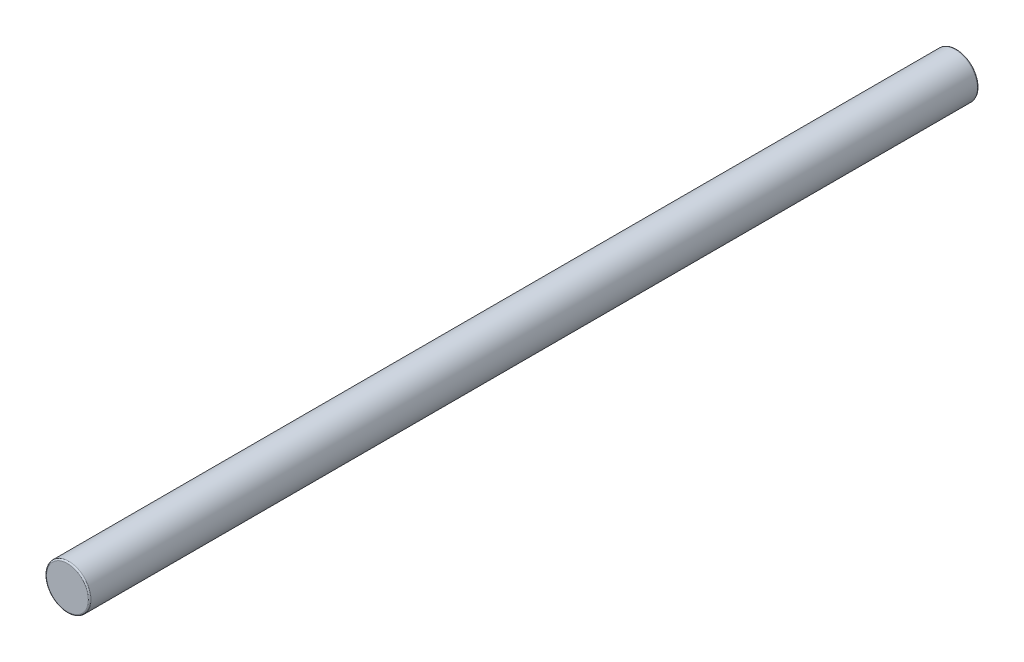
ISO-10303-21;
HEADER;
FILE_DESCRIPTION(('STEP AP214'),'2;1');
FILE_NAME('part.step','',(''),(''),'','','');
FILE_SCHEMA(('AUTOMOTIVE_DESIGN { 1 0 10303 214 1 1 1 1 }'));
ENDSEC;
DATA;
#1=APPLICATION_CONTEXT('core data for automotive mechanical design processes');
#2=APPLICATION_PROTOCOL_DEFINITION('international standard','automotive_design',2000,#1);
#3=PRODUCT_CONTEXT('',#1,'mechanical');
#4=PRODUCT('Part','Part','',(#3));
#5=PRODUCT_RELATED_PRODUCT_CATEGORY('part','',(#4));
#6=PRODUCT_DEFINITION_FORMATION('','',#4);
#7=PRODUCT_DEFINITION_CONTEXT('part definition',#1,'design');
#8=PRODUCT_DEFINITION('design','',#6,#7);
#9=PRODUCT_DEFINITION_SHAPE('','',#8);
#10=(LENGTH_UNIT() NAMED_UNIT(*) SI_UNIT(.MILLI.,.METRE.));
#11=(NAMED_UNIT(*) PLANE_ANGLE_UNIT() SI_UNIT($,.RADIAN.));
#12=(NAMED_UNIT(*) SI_UNIT($,.STERADIAN.) SOLID_ANGLE_UNIT());
#13=UNCERTAINTY_MEASURE_WITH_UNIT(LENGTH_MEASURE(1.E-05),#10,'distance_accuracy_value','');
#14=(GEOMETRIC_REPRESENTATION_CONTEXT(3) GLOBAL_UNCERTAINTY_ASSIGNED_CONTEXT((#13)) GLOBAL_UNIT_ASSIGNED_CONTEXT((#10,
#11,#12)) REPRESENTATION_CONTEXT('',''));
#15=CARTESIAN_POINT('',(0.,0.,0.));
#16=DIRECTION('',(0.,0.,1.));
#17=DIRECTION('',(1.,0.,0.));
#18=AXIS2_PLACEMENT_3D('',#15,#16,#17);
#19=CARTESIAN_POINT('',(0.,0.,100.));
#20=DIRECTION('',(0.,0.,-1.));
#21=DIRECTION('',(-1.,0.,0.));
#22=AXIS2_PLACEMENT_3D('',#19,#20,#21);
#23=CYLINDRICAL_SURFACE('',#22,5.);
#24=CARTESIAN_POINT('',(0.,0.,-99.7));
#25=DIRECTION('',(0.,0.,1.));
#26=DIRECTION('',(1.,0.,0.));
#27=AXIS2_PLACEMENT_3D('',#24,#25,#26);
#28=CIRCLE('',#27,5.);
#29=CARTESIAN_POINT('',(5.,0.,-99.7));
#30=VERTEX_POINT('',#29);
#31=EDGE_CURVE('E49',#30,#30,#28,.T.);
#32=ORIENTED_EDGE('',*,*,#31,.T.);
#33=EDGE_LOOP('',(#32));
#34=FACE_BOUND('',#33,.T.);
#35=CARTESIAN_POINT('',(0.,0.,99.7));
#36=DIRECTION('',(0.,0.,1.));
#37=DIRECTION('',(1.,0.,0.));
#38=AXIS2_PLACEMENT_3D('',#35,#36,#37);
#39=CIRCLE('',#38,5.);
#40=CARTESIAN_POINT('',(5.,0.,99.7));
#41=VERTEX_POINT('',#40);
#42=EDGE_CURVE('E54',#41,#41,#39,.F.);
#43=ORIENTED_EDGE('',*,*,#42,.T.);
#44=EDGE_LOOP('',(#43));
#45=FACE_BOUND('',#44,.T.);
#46=ADVANCED_FACE('F36',(#34,#45),#23,.T.);
#47=CARTESIAN_POINT('',(0.,0.,100.));
#48=DIRECTION('',(0.,0.,1.));
#49=DIRECTION('',(1.,0.,0.));
#50=AXIS2_PLACEMENT_3D('',#47,#48,#49);
#51=PLANE('',#50);
#52=CARTESIAN_POINT('',(0.,0.,100.));
#53=DIRECTION('',(0.,0.,1.));
#54=DIRECTION('',(1.,0.,0.));
#55=AXIS2_PLACEMENT_3D('',#52,#53,#54);
#56=CIRCLE('',#55,4.7);
#57=CARTESIAN_POINT('',(4.7,0.,100.));
#58=VERTEX_POINT('',#57);
#59=EDGE_CURVE('E10',#58,#58,#56,.T.);
#60=ORIENTED_EDGE('',*,*,#59,.T.);
#61=EDGE_LOOP('',(#60));
#62=FACE_BOUND('',#61,.T.);
#63=ADVANCED_FACE('F71',(#62),#51,.T.);
#64=CARTESIAN_POINT('',(0.,0.,-100.));
#65=DIRECTION('',(0.,0.,1.));
#66=DIRECTION('',(1.,0.,0.));
#67=AXIS2_PLACEMENT_3D('',#64,#65,#66);
#68=PLANE('',#67);
#69=CARTESIAN_POINT('',(0.,0.,-100.));
#70=DIRECTION('',(0.,0.,1.));
#71=DIRECTION('',(1.,0.,0.));
#72=AXIS2_PLACEMENT_3D('',#69,#70,#71);
#73=CIRCLE('',#72,4.7);
#74=CARTESIAN_POINT('',(4.7,0.,-100.));
#75=VERTEX_POINT('',#74);
#76=EDGE_CURVE('E44',#75,#75,#73,.F.);
#77=ORIENTED_EDGE('',*,*,#76,.T.);
#78=EDGE_LOOP('',(#77));
#79=FACE_BOUND('',#78,.T.);
#80=ADVANCED_FACE('F68',(#79),#68,.F.);
#81=CARTESIAN_POINT('',(0.,0.,-99.7));
#82=DIRECTION('',(0.,0.,1.));
#83=DIRECTION('',(1.,0.,0.));
#84=AXIS2_PLACEMENT_3D('',#81,#82,#83);
#85=TOROIDAL_SURFACE('',#84,4.7,0.3);
#86=ORIENTED_EDGE('',*,*,#76,.F.);
#87=EDGE_LOOP('',(#86));
#88=FACE_BOUND('',#87,.T.);
#89=ORIENTED_EDGE('',*,*,#31,.F.);
#90=EDGE_LOOP('',(#89));
#91=FACE_BOUND('',#90,.T.);
#92=ADVANCED_FACE('F64',(#88,#91),#85,.T.);
#93=CARTESIAN_POINT('',(0.,0.,99.7));
#94=DIRECTION('',(0.,0.,1.));
#95=DIRECTION('',(1.,0.,0.));
#96=AXIS2_PLACEMENT_3D('',#93,#94,#95);
#97=TOROIDAL_SURFACE('',#96,4.7,0.3);
#98=ORIENTED_EDGE('',*,*,#42,.F.);
#99=EDGE_LOOP('',(#98));
#100=FACE_BOUND('',#99,.T.);
#101=ORIENTED_EDGE('',*,*,#59,.F.);
#102=EDGE_LOOP('',(#101));
#103=FACE_BOUND('',#102,.T.);
#104=ADVANCED_FACE('F38',(#100,#103),#97,.T.);
#105=CLOSED_SHELL('',(#46,#63,#80,#92,#104));
#106=MANIFOLD_SOLID_BREP('B2',#105);
#107=ADVANCED_BREP_SHAPE_REPRESENTATION('',(#18,#106),#14);
#108=SHAPE_DEFINITION_REPRESENTATION(#9,#107);
ENDSEC;
END-ISO-10303-21;
